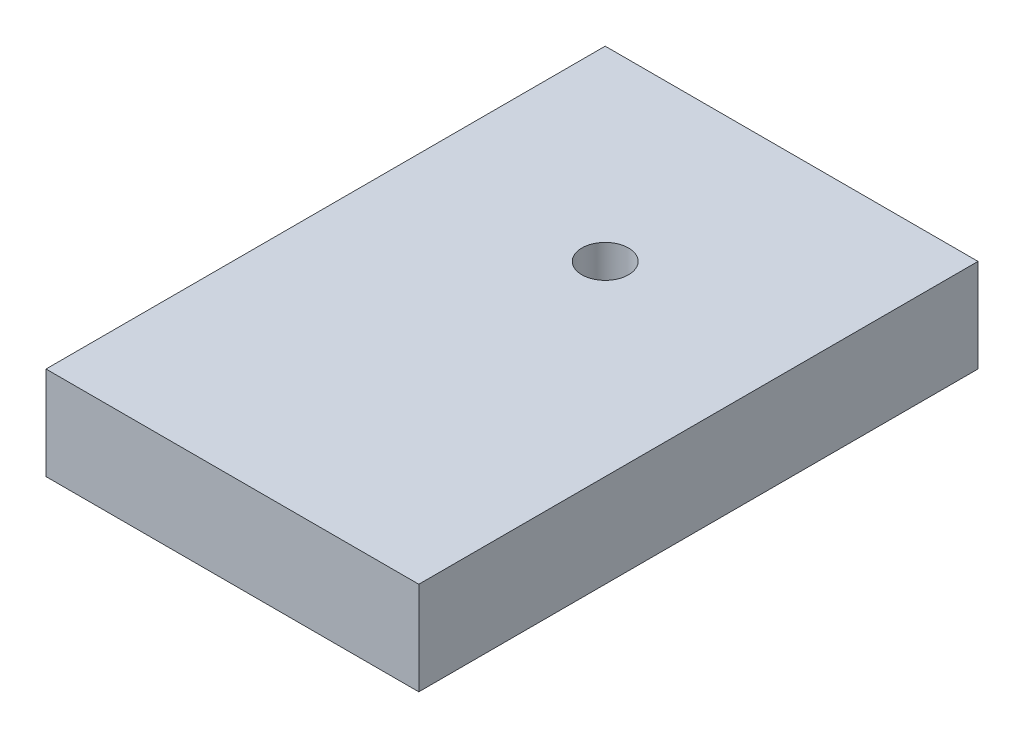
ISO-10303-21;
HEADER;
FILE_DESCRIPTION(('STEP AP214'),'2;1');
FILE_NAME('part.step','',(''),(''),'','','');
FILE_SCHEMA(('AUTOMOTIVE_DESIGN { 1 0 10303 214 1 1 1 1 }'));
ENDSEC;
DATA;
#1=APPLICATION_CONTEXT('core data for automotive mechanical design processes');
#2=APPLICATION_PROTOCOL_DEFINITION('international standard','automotive_design',2000,#1);
#3=PRODUCT_CONTEXT('',#1,'mechanical');
#4=PRODUCT('Part','Part','',(#3));
#5=PRODUCT_RELATED_PRODUCT_CATEGORY('part','',(#4));
#6=PRODUCT_DEFINITION_FORMATION('','',#4);
#7=PRODUCT_DEFINITION_CONTEXT('part definition',#1,'design');
#8=PRODUCT_DEFINITION('design','',#6,#7);
#9=PRODUCT_DEFINITION_SHAPE('','',#8);
#10=(LENGTH_UNIT() NAMED_UNIT(*) SI_UNIT(.MILLI.,.METRE.));
#11=(NAMED_UNIT(*) PLANE_ANGLE_UNIT() SI_UNIT($,.RADIAN.));
#12=(NAMED_UNIT(*) SI_UNIT($,.STERADIAN.) SOLID_ANGLE_UNIT());
#13=UNCERTAINTY_MEASURE_WITH_UNIT(LENGTH_MEASURE(1.E-05),#10,'distance_accuracy_value','');
#14=(GEOMETRIC_REPRESENTATION_CONTEXT(3) GLOBAL_UNCERTAINTY_ASSIGNED_CONTEXT((#13)) GLOBAL_UNIT_ASSIGNED_CONTEXT((#10,
#11,#12)) REPRESENTATION_CONTEXT('',''));
#15=CARTESIAN_POINT('',(0.,0.,0.));
#16=DIRECTION('',(0.,0.,1.));
#17=DIRECTION('',(1.,0.,0.));
#18=AXIS2_PLACEMENT_3D('',#15,#16,#17);
#19=CARTESIAN_POINT('',(0.,6.35,0.));
#20=DIRECTION('',(0.,1.,0.));
#21=DIRECTION('',(0.,0.,1.));
#22=AXIS2_PLACEMENT_3D('',#19,#20,#21);
#23=PLANE('',#22);
#24=DIRECTION('',(0.,0.,1.));
#25=VECTOR('',#24,1.);
#26=CARTESIAN_POINT('',(0.,6.35,0.));
#27=LINE('',#26,#25);
#28=CARTESIAN_POINT('',(0.,6.35,0.));
#29=VERTEX_POINT('',#28);
#30=CARTESIAN_POINT('',(0.,6.35,38.1));
#31=VERTEX_POINT('',#30);
#32=EDGE_CURVE('E85',#29,#31,#27,.T.);
#33=ORIENTED_EDGE('',*,*,#32,.T.);
#34=DIRECTION('',(1.,0.,0.));
#35=VECTOR('',#34,1.);
#36=CARTESIAN_POINT('',(0.,6.35,38.1));
#37=LINE('',#36,#35);
#38=CARTESIAN_POINT('',(25.4,6.35,38.1));
#39=VERTEX_POINT('',#38);
#40=EDGE_CURVE('E80',#31,#39,#37,.T.);
#41=ORIENTED_EDGE('',*,*,#40,.T.);
#42=DIRECTION('',(0.,0.,-1.));
#43=VECTOR('',#42,1.);
#44=CARTESIAN_POINT('',(25.4,6.35,0.));
#45=LINE('',#44,#43);
#46=CARTESIAN_POINT('',(25.4,6.35,0.));
#47=VERTEX_POINT('',#46);
#48=EDGE_CURVE('E83',#39,#47,#45,.T.);
#49=ORIENTED_EDGE('',*,*,#48,.T.);
#50=DIRECTION('',(-1.,0.,0.));
#51=VECTOR('',#50,1.);
#52=CARTESIAN_POINT('',(0.,6.35,0.));
#53=LINE('',#52,#51);
#54=EDGE_CURVE('E50',#47,#29,#53,.T.);
#55=ORIENTED_EDGE('',*,*,#54,.T.);
#56=EDGE_LOOP('',(#33,#41,#49,#55));
#57=FACE_BOUND('',#56,.T.);
#58=CARTESIAN_POINT('',(12.7,6.35,12.7));
#59=DIRECTION('',(0.,1.,0.));
#60=DIRECTION('',(0.,0.,1.));
#61=AXIS2_PLACEMENT_3D('',#58,#59,#60);
#62=CIRCLE('',#61,1.5875);
#63=CARTESIAN_POINT('',(12.7,6.35,14.2875));
#64=VERTEX_POINT('',#63);
#65=EDGE_CURVE('E100',#64,#64,#62,.T.);
#66=ORIENTED_EDGE('',*,*,#65,.F.);
#67=EDGE_LOOP('',(#66));
#68=FACE_BOUND('',#67,.T.);
#69=ADVANCED_FACE('F33',(#57,#68),#23,.T.);
#70=CARTESIAN_POINT('',(0.,0.,0.));
#71=DIRECTION('',(0.,1.,0.));
#72=DIRECTION('',(0.,0.,1.));
#73=AXIS2_PLACEMENT_3D('',#70,#71,#72);
#74=PLANE('',#73);
#75=DIRECTION('',(0.,0.,1.));
#76=VECTOR('',#75,1.);
#77=CARTESIAN_POINT('',(0.,0.,0.));
#78=LINE('',#77,#76);
#79=CARTESIAN_POINT('',(0.,0.,0.));
#80=VERTEX_POINT('',#79);
#81=CARTESIAN_POINT('',(0.,0.,38.1));
#82=VERTEX_POINT('',#81);
#83=EDGE_CURVE('E97',#80,#82,#78,.T.);
#84=ORIENTED_EDGE('',*,*,#83,.F.);
#85=DIRECTION('',(-1.,0.,0.));
#86=VECTOR('',#85,1.);
#87=CARTESIAN_POINT('',(0.,0.,0.));
#88=LINE('',#87,#86);
#89=CARTESIAN_POINT('',(25.4,0.,0.));
#90=VERTEX_POINT('',#89);
#91=EDGE_CURVE('E73',#90,#80,#88,.T.);
#92=ORIENTED_EDGE('',*,*,#91,.F.);
#93=DIRECTION('',(0.,0.,-1.));
#94=VECTOR('',#93,1.);
#95=CARTESIAN_POINT('',(25.4,0.,0.));
#96=LINE('',#95,#94);
#97=CARTESIAN_POINT('',(25.4,0.,38.1));
#98=VERTEX_POINT('',#97);
#99=EDGE_CURVE('E67',#98,#90,#96,.T.);
#100=ORIENTED_EDGE('',*,*,#99,.F.);
#101=DIRECTION('',(1.,0.,0.));
#102=VECTOR('',#101,1.);
#103=CARTESIAN_POINT('',(0.,0.,38.1));
#104=LINE('',#103,#102);
#105=EDGE_CURVE('E89',#82,#98,#104,.T.);
#106=ORIENTED_EDGE('',*,*,#105,.F.);
#107=EDGE_LOOP('',(#84,#92,#100,#106));
#108=FACE_BOUND('',#107,.T.);
#109=CARTESIAN_POINT('',(12.7,0.,12.7));
#110=DIRECTION('',(0.,1.,0.));
#111=DIRECTION('',(0.,0.,1.));
#112=AXIS2_PLACEMENT_3D('',#109,#110,#111);
#113=CIRCLE('',#112,1.5875);
#114=CARTESIAN_POINT('',(12.7,0.,14.2875));
#115=VERTEX_POINT('',#114);
#116=EDGE_CURVE('E112',#115,#115,#113,.T.);
#117=ORIENTED_EDGE('',*,*,#116,.T.);
#118=EDGE_LOOP('',(#117));
#119=FACE_BOUND('',#118,.T.);
#120=ADVANCED_FACE('F108',(#108,#119),#74,.F.);
#121=CARTESIAN_POINT('',(0.,6.35,0.));
#122=DIRECTION('',(1.,0.,0.));
#123=DIRECTION('',(0.,0.,-1.));
#124=AXIS2_PLACEMENT_3D('',#121,#122,#123);
#125=PLANE('',#124);
#126=ORIENTED_EDGE('',*,*,#83,.T.);
#127=DIRECTION('',(0.,-1.,0.));
#128=VECTOR('',#127,1.);
#129=CARTESIAN_POINT('',(0.,6.35,38.1));
#130=LINE('',#129,#128);
#131=EDGE_CURVE('E11',#31,#82,#130,.T.);
#132=ORIENTED_EDGE('',*,*,#131,.F.);
#133=ORIENTED_EDGE('',*,*,#32,.F.);
#134=DIRECTION('',(0.,-1.,0.));
#135=VECTOR('',#134,1.);
#136=CARTESIAN_POINT('',(0.,6.35,0.));
#137=LINE('',#136,#135);
#138=EDGE_CURVE('E93',#29,#80,#137,.T.);
#139=ORIENTED_EDGE('',*,*,#138,.T.);
#140=EDGE_LOOP('',(#126,#132,#133,#139));
#141=FACE_BOUND('',#140,.T.);
#142=ADVANCED_FACE('F35',(#141),#125,.F.);
#143=CARTESIAN_POINT('',(0.,6.35,38.1));
#144=DIRECTION('',(0.,0.,-1.));
#145=DIRECTION('',(-1.,0.,0.));
#146=AXIS2_PLACEMENT_3D('',#143,#144,#145);
#147=PLANE('',#146);
#148=ORIENTED_EDGE('',*,*,#105,.T.);
#149=DIRECTION('',(0.,-1.,0.));
#150=VECTOR('',#149,1.);
#151=CARTESIAN_POINT('',(25.4,6.35,38.1));
#152=LINE('',#151,#150);
#153=EDGE_CURVE('E42',#39,#98,#152,.T.);
#154=ORIENTED_EDGE('',*,*,#153,.F.);
#155=ORIENTED_EDGE('',*,*,#40,.F.);
#156=ORIENTED_EDGE('',*,*,#131,.T.);
#157=EDGE_LOOP('',(#148,#154,#155,#156));
#158=FACE_BOUND('',#157,.T.);
#159=ADVANCED_FACE('F88',(#158),#147,.F.);
#160=CARTESIAN_POINT('',(25.4,6.35,0.));
#161=DIRECTION('',(-1.,0.,0.));
#162=DIRECTION('',(0.,0.,1.));
#163=AXIS2_PLACEMENT_3D('',#160,#161,#162);
#164=PLANE('',#163);
#165=ORIENTED_EDGE('',*,*,#99,.T.);
#166=DIRECTION('',(0.,-1.,0.));
#167=VECTOR('',#166,1.);
#168=CARTESIAN_POINT('',(25.4,6.35,0.));
#169=LINE('',#168,#167);
#170=EDGE_CURVE('E90',#47,#90,#169,.T.);
#171=ORIENTED_EDGE('',*,*,#170,.F.);
#172=ORIENTED_EDGE('',*,*,#48,.F.);
#173=ORIENTED_EDGE('',*,*,#153,.T.);
#174=EDGE_LOOP('',(#165,#171,#172,#173));
#175=FACE_BOUND('',#174,.T.);
#176=ADVANCED_FACE('F91',(#175),#164,.F.);
#177=CARTESIAN_POINT('',(0.,6.35,0.));
#178=DIRECTION('',(0.,0.,1.));
#179=DIRECTION('',(1.,0.,0.));
#180=AXIS2_PLACEMENT_3D('',#177,#178,#179);
#181=PLANE('',#180);
#182=ORIENTED_EDGE('',*,*,#91,.T.);
#183=ORIENTED_EDGE('',*,*,#138,.F.);
#184=ORIENTED_EDGE('',*,*,#54,.F.);
#185=ORIENTED_EDGE('',*,*,#170,.T.);
#186=EDGE_LOOP('',(#182,#183,#184,#185));
#187=FACE_BOUND('',#186,.T.);
#188=ADVANCED_FACE('F105',(#187),#181,.F.);
#189=CARTESIAN_POINT('',(12.7,6.35,12.7));
#190=DIRECTION('',(0.,-1.,0.));
#191=DIRECTION('',(0.,0.,-1.));
#192=AXIS2_PLACEMENT_3D('',#189,#190,#191);
#193=CYLINDRICAL_SURFACE('',#192,1.5875);
#194=ORIENTED_EDGE('',*,*,#65,.T.);
#195=EDGE_LOOP('',(#194));
#196=FACE_BOUND('',#195,.T.);
#197=ORIENTED_EDGE('',*,*,#116,.F.);
#198=EDGE_LOOP('',(#197));
#199=FACE_BOUND('',#198,.T.);
#200=ADVANCED_FACE('F118',(#196,#199),#193,.F.);
#201=CLOSED_SHELL('',(#69,#120,#142,#159,#176,#188,#200));
#202=MANIFOLD_SOLID_BREP('B2',#201);
#203=ADVANCED_BREP_SHAPE_REPRESENTATION('',(#18,#202),#14);
#204=SHAPE_DEFINITION_REPRESENTATION(#9,#203);
ENDSEC;
END-ISO-10303-21;
